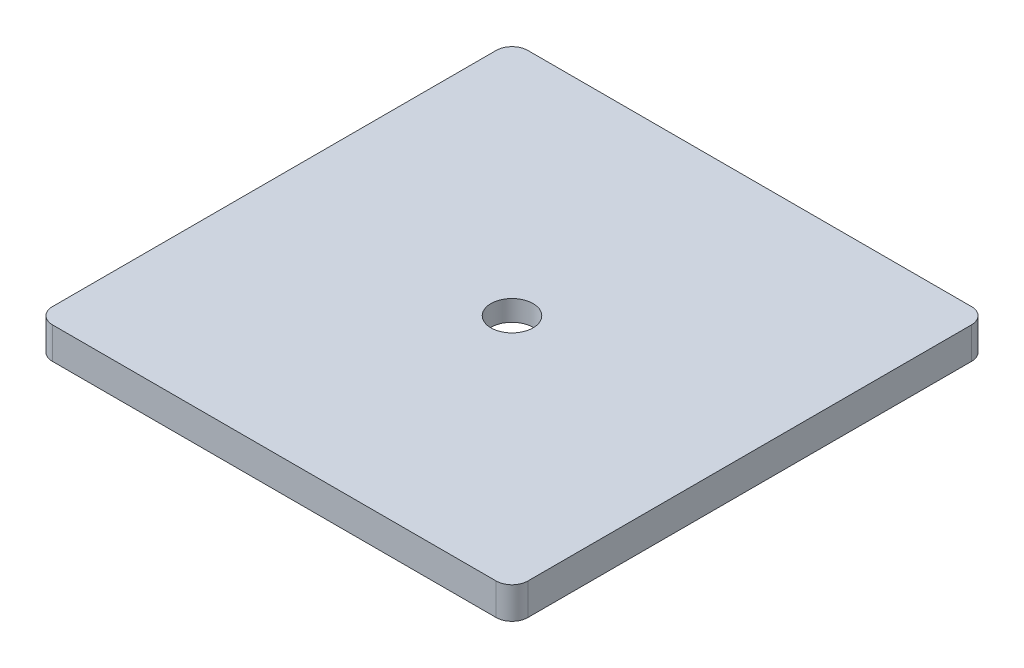
ISO-10303-21;
HEADER;
FILE_DESCRIPTION(('STEP AP214'),'2;1');
FILE_NAME('part.step','',(''),(''),'','','');
FILE_SCHEMA(('AUTOMOTIVE_DESIGN { 1 0 10303 214 1 1 1 1 }'));
ENDSEC;
DATA;
#1=APPLICATION_CONTEXT('core data for automotive mechanical design processes');
#2=APPLICATION_PROTOCOL_DEFINITION('international standard','automotive_design',2000,#1);
#3=PRODUCT_CONTEXT('',#1,'mechanical');
#4=PRODUCT('Part','Part','',(#3));
#5=PRODUCT_RELATED_PRODUCT_CATEGORY('part','',(#4));
#6=PRODUCT_DEFINITION_FORMATION('','',#4);
#7=PRODUCT_DEFINITION_CONTEXT('part definition',#1,'design');
#8=PRODUCT_DEFINITION('design','',#6,#7);
#9=PRODUCT_DEFINITION_SHAPE('','',#8);
#10=(LENGTH_UNIT() NAMED_UNIT(*) SI_UNIT(.MILLI.,.METRE.));
#11=(NAMED_UNIT(*) PLANE_ANGLE_UNIT() SI_UNIT($,.RADIAN.));
#12=(NAMED_UNIT(*) SI_UNIT($,.STERADIAN.) SOLID_ANGLE_UNIT());
#13=UNCERTAINTY_MEASURE_WITH_UNIT(LENGTH_MEASURE(1.E-05),#10,'distance_accuracy_value','');
#14=(GEOMETRIC_REPRESENTATION_CONTEXT(3) GLOBAL_UNCERTAINTY_ASSIGNED_CONTEXT((#13)) GLOBAL_UNIT_ASSIGNED_CONTEXT((#10,
#11,#12)) REPRESENTATION_CONTEXT('',''));
#15=CARTESIAN_POINT('',(0.,0.,0.));
#16=DIRECTION('',(0.,0.,1.));
#17=DIRECTION('',(1.,0.,0.));
#18=AXIS2_PLACEMENT_3D('',#15,#16,#17);
#19=CARTESIAN_POINT('',(38.1,5.08,-38.1));
#20=DIRECTION('',(-1.,0.,0.));
#21=DIRECTION('',(0.,0.,1.));
#22=AXIS2_PLACEMENT_3D('',#19,#20,#21);
#23=PLANE('',#22);
#24=DIRECTION('',(0.,0.,-1.));
#25=VECTOR('',#24,1.);
#26=CARTESIAN_POINT('',(38.1,0.,-38.1));
#27=LINE('',#26,#25);
#28=CARTESIAN_POINT('',(38.1,0.,35.56));
#29=VERTEX_POINT('',#28);
#30=CARTESIAN_POINT('',(38.1,0.,-35.56));
#31=VERTEX_POINT('',#30);
#32=EDGE_CURVE('E355',#29,#31,#27,.T.);
#33=ORIENTED_EDGE('',*,*,#32,.T.);
#34=DIRECTION('',(0.,-1.,0.));
#35=VECTOR('',#34,1.);
#36=CARTESIAN_POINT('',(38.1,5.08,-35.56));
#37=LINE('',#36,#35);
#38=CARTESIAN_POINT('',(38.1,5.08,-35.56));
#39=VERTEX_POINT('',#38);
#40=EDGE_CURVE('E394',#31,#39,#37,.F.);
#41=ORIENTED_EDGE('',*,*,#40,.T.);
#42=DIRECTION('',(0.,0.,-1.));
#43=VECTOR('',#42,1.);
#44=CARTESIAN_POINT('',(38.1,5.08,-38.1));
#45=LINE('',#44,#43);
#46=CARTESIAN_POINT('',(38.1,5.08,35.56));
#47=VERTEX_POINT('',#46);
#48=EDGE_CURVE('E336',#47,#39,#45,.T.);
#49=ORIENTED_EDGE('',*,*,#48,.F.);
#50=DIRECTION('',(0.,-1.,0.));
#51=VECTOR('',#50,1.);
#52=CARTESIAN_POINT('',(38.1,5.08,35.56));
#53=LINE('',#52,#51);
#54=EDGE_CURVE('E391',#47,#29,#53,.T.);
#55=ORIENTED_EDGE('',*,*,#54,.T.);
#56=EDGE_LOOP('',(#33,#41,#49,#55));
#57=FACE_BOUND('',#56,.T.);
#58=ADVANCED_FACE('F46',(#57),#23,.F.);
#59=CARTESIAN_POINT('',(-38.1,5.08,-38.1));
#60=DIRECTION('',(0.,0.,1.));
#61=DIRECTION('',(1.,0.,0.));
#62=AXIS2_PLACEMENT_3D('',#59,#60,#61);
#63=PLANE('',#62);
#64=DIRECTION('',(-1.,0.,0.));
#65=VECTOR('',#64,1.);
#66=CARTESIAN_POINT('',(-38.1,0.,-38.1));
#67=LINE('',#66,#65);
#68=CARTESIAN_POINT('',(35.56,0.,-38.1));
#69=VERTEX_POINT('',#68);
#70=CARTESIAN_POINT('',(-35.56,0.,-38.1));
#71=VERTEX_POINT('',#70);
#72=EDGE_CURVE('E358',#69,#71,#67,.T.);
#73=ORIENTED_EDGE('',*,*,#72,.T.);
#74=DIRECTION('',(0.,-1.,0.));
#75=VECTOR('',#74,1.);
#76=CARTESIAN_POINT('',(-35.56,5.08,-38.1));
#77=LINE('',#76,#75);
#78=CARTESIAN_POINT('',(-35.56,5.08,-38.1));
#79=VERTEX_POINT('',#78);
#80=EDGE_CURVE('E381',#71,#79,#77,.F.);
#81=ORIENTED_EDGE('',*,*,#80,.T.);
#82=DIRECTION('',(-1.,0.,0.));
#83=VECTOR('',#82,1.);
#84=CARTESIAN_POINT('',(-38.1,5.08,-38.1));
#85=LINE('',#84,#83);
#86=CARTESIAN_POINT('',(35.56,5.08,-38.1));
#87=VERTEX_POINT('',#86);
#88=EDGE_CURVE('E344',#87,#79,#85,.T.);
#89=ORIENTED_EDGE('',*,*,#88,.F.);
#90=DIRECTION('',(0.,-1.,0.));
#91=VECTOR('',#90,1.);
#92=CARTESIAN_POINT('',(35.56,5.08,-38.1));
#93=LINE('',#92,#91);
#94=EDGE_CURVE('E378',#87,#69,#93,.T.);
#95=ORIENTED_EDGE('',*,*,#94,.T.);
#96=EDGE_LOOP('',(#73,#81,#89,#95));
#97=FACE_BOUND('',#96,.T.);
#98=ADVANCED_FACE('F528',(#97),#63,.F.);
#99=CARTESIAN_POINT('',(-38.1,5.08,-38.1));
#100=DIRECTION('',(1.,0.,0.));
#101=DIRECTION('',(0.,0.,-1.));
#102=AXIS2_PLACEMENT_3D('',#99,#100,#101);
#103=PLANE('',#102);
#104=DIRECTION('',(0.,0.,1.));
#105=VECTOR('',#104,1.);
#106=CARTESIAN_POINT('',(-38.1,5.08,-38.1));
#107=LINE('',#106,#105);
#108=CARTESIAN_POINT('',(-38.1,5.08,-35.56));
#109=VERTEX_POINT('',#108);
#110=CARTESIAN_POINT('',(-38.1,5.08,35.56));
#111=VERTEX_POINT('',#110);
#112=EDGE_CURVE('E348',#109,#111,#107,.T.);
#113=ORIENTED_EDGE('',*,*,#112,.F.);
#114=DIRECTION('',(0.,-1.,0.));
#115=VECTOR('',#114,1.);
#116=CARTESIAN_POINT('',(-38.1,5.08,-35.56));
#117=LINE('',#116,#115);
#118=CARTESIAN_POINT('',(-38.1,0.,-35.56));
#119=VERTEX_POINT('',#118);
#120=EDGE_CURVE('E367',#109,#119,#117,.T.);
#121=ORIENTED_EDGE('',*,*,#120,.T.);
#122=DIRECTION('',(0.,0.,1.));
#123=VECTOR('',#122,1.);
#124=CARTESIAN_POINT('',(-38.1,0.,-38.1));
#125=LINE('',#124,#123);
#126=CARTESIAN_POINT('',(-38.1,0.,35.56));
#127=VERTEX_POINT('',#126);
#128=EDGE_CURVE('E361',#119,#127,#125,.T.);
#129=ORIENTED_EDGE('',*,*,#128,.T.);
#130=DIRECTION('',(0.,-1.,0.));
#131=VECTOR('',#130,1.);
#132=CARTESIAN_POINT('',(-38.1,5.08,35.56));
#133=LINE('',#132,#131);
#134=EDGE_CURVE('E354',#127,#111,#133,.F.);
#135=ORIENTED_EDGE('',*,*,#134,.T.);
#136=EDGE_LOOP('',(#113,#121,#129,#135));
#137=FACE_BOUND('',#136,.T.);
#138=ADVANCED_FACE('F534',(#137),#103,.F.);
#139=CARTESIAN_POINT('',(-38.1,5.08,38.1));
#140=DIRECTION('',(0.,0.,-1.));
#141=DIRECTION('',(-1.,0.,0.));
#142=AXIS2_PLACEMENT_3D('',#139,#140,#141);
#143=PLANE('',#142);
#144=DIRECTION('',(1.,0.,0.));
#145=VECTOR('',#144,1.);
#146=CARTESIAN_POINT('',(-38.1,5.08,38.1));
#147=LINE('',#146,#145);
#148=CARTESIAN_POINT('',(-35.56,5.08,38.1));
#149=VERTEX_POINT('',#148);
#150=CARTESIAN_POINT('',(35.56,5.08,38.1));
#151=VERTEX_POINT('',#150);
#152=EDGE_CURVE('E351',#149,#151,#147,.T.);
#153=ORIENTED_EDGE('',*,*,#152,.F.);
#154=DIRECTION('',(0.,-1.,0.));
#155=VECTOR('',#154,1.);
#156=CARTESIAN_POINT('',(-35.56,5.08,38.1));
#157=LINE('',#156,#155);
#158=CARTESIAN_POINT('',(-35.56,0.,38.1));
#159=VERTEX_POINT('',#158);
#160=EDGE_CURVE('E12',#149,#159,#157,.T.);
#161=ORIENTED_EDGE('',*,*,#160,.T.);
#162=DIRECTION('',(1.,0.,0.));
#163=VECTOR('',#162,1.);
#164=CARTESIAN_POINT('',(-38.1,0.,38.1));
#165=LINE('',#164,#163);
#166=CARTESIAN_POINT('',(35.56,0.,38.1));
#167=VERTEX_POINT('',#166);
#168=EDGE_CURVE('E345',#159,#167,#165,.T.);
#169=ORIENTED_EDGE('',*,*,#168,.T.);
#170=DIRECTION('',(0.,-1.,0.));
#171=VECTOR('',#170,1.);
#172=CARTESIAN_POINT('',(35.56,5.08,38.1));
#173=LINE('',#172,#171);
#174=EDGE_CURVE('E55',#167,#151,#173,.F.);
#175=ORIENTED_EDGE('',*,*,#174,.T.);
#176=EDGE_LOOP('',(#153,#161,#169,#175));
#177=FACE_BOUND('',#176,.T.);
#178=ADVANCED_FACE('F563',(#177),#143,.F.);
#179=CARTESIAN_POINT('',(0.,5.08,0.));
#180=DIRECTION('',(0.,1.,0.));
#181=DIRECTION('',(0.,0.,1.));
#182=AXIS2_PLACEMENT_3D('',#179,#180,#181);
#183=PLANE('',#182);
#184=CARTESIAN_POINT('',(0.,5.08,0.));
#185=DIRECTION('',(0.,-1.,0.));
#186=DIRECTION('',(0.,0.,-1.));
#187=AXIS2_PLACEMENT_3D('',#184,#185,#186);
#188=CIRCLE('',#187,3.3782);
#189=CARTESIAN_POINT('',(0.,5.08,-3.3782));
#190=VERTEX_POINT('',#189);
#191=EDGE_CURVE('E237',#190,#190,#188,.T.);
#192=ORIENTED_EDGE('',*,*,#191,.T.);
#193=EDGE_LOOP('',(#192));
#194=FACE_BOUND('',#193,.T.);
#195=ORIENTED_EDGE('',*,*,#88,.T.);
#196=CARTESIAN_POINT('',(-35.56,5.08,-35.56));
#197=DIRECTION('',(0.,1.,0.));
#198=DIRECTION('',(0.,0.,1.));
#199=AXIS2_PLACEMENT_3D('',#196,#197,#198);
#200=CIRCLE('',#199,2.54);
#201=EDGE_CURVE('E389',#79,#109,#200,.T.);
#202=ORIENTED_EDGE('',*,*,#201,.T.);
#203=ORIENTED_EDGE('',*,*,#112,.T.);
#204=CARTESIAN_POINT('',(-35.56,5.08,35.56));
#205=DIRECTION('',(0.,1.,0.));
#206=DIRECTION('',(0.,0.,1.));
#207=AXIS2_PLACEMENT_3D('',#204,#205,#206);
#208=CIRCLE('',#207,2.54);
#209=EDGE_CURVE('E385',#111,#149,#208,.T.);
#210=ORIENTED_EDGE('',*,*,#209,.T.);
#211=ORIENTED_EDGE('',*,*,#152,.T.);
#212=CARTESIAN_POINT('',(35.56,5.08,35.56));
#213=DIRECTION('',(0.,1.,0.));
#214=DIRECTION('',(0.,0.,1.));
#215=AXIS2_PLACEMENT_3D('',#212,#213,#214);
#216=CIRCLE('',#215,2.54);
#217=EDGE_CURVE('E383',#151,#47,#216,.T.);
#218=ORIENTED_EDGE('',*,*,#217,.T.);
#219=ORIENTED_EDGE('',*,*,#48,.T.);
#220=CARTESIAN_POINT('',(35.56,5.08,-35.56));
#221=DIRECTION('',(0.,1.,0.));
#222=DIRECTION('',(0.,0.,1.));
#223=AXIS2_PLACEMENT_3D('',#220,#221,#222);
#224=CIRCLE('',#223,2.54);
#225=EDGE_CURVE('E387',#39,#87,#224,.T.);
#226=ORIENTED_EDGE('',*,*,#225,.T.);
#227=EDGE_LOOP('',(#195,#202,#203,#210,#211,#218,#219,#226));
#228=FACE_BOUND('',#227,.T.);
#229=ADVANCED_FACE('F559',(#194,#228),#183,.T.);
#230=CARTESIAN_POINT('',(0.,0.,0.));
#231=DIRECTION('',(0.,1.,0.));
#232=DIRECTION('',(0.,0.,1.));
#233=AXIS2_PLACEMENT_3D('',#230,#231,#232);
#234=PLANE('',#233);
#235=DIRECTION('',(-1.,0.,0.));
#236=VECTOR('',#235,1.);
#237=CARTESIAN_POINT('',(-17.5895,0.,17.5895));
#238=LINE('',#237,#236);
#239=CARTESIAN_POINT('',(17.5895,0.,17.5895));
#240=VERTEX_POINT('',#239);
#241=CARTESIAN_POINT('',(-17.5895,0.,17.5895));
#242=VERTEX_POINT('',#241);
#243=EDGE_CURVE('E272',#240,#242,#238,.T.);
#244=ORIENTED_EDGE('',*,*,#243,.F.);
#245=DIRECTION('',(0.,0.,1.));
#246=VECTOR('',#245,1.);
#247=CARTESIAN_POINT('',(17.5895,0.,17.5895));
#248=LINE('',#247,#246);
#249=CARTESIAN_POINT('',(17.5895,0.,-17.5895));
#250=VERTEX_POINT('',#249);
#251=EDGE_CURVE('E397',#250,#240,#248,.T.);
#252=ORIENTED_EDGE('',*,*,#251,.F.);
#253=DIRECTION('',(1.,0.,0.));
#254=VECTOR('',#253,1.);
#255=CARTESIAN_POINT('',(-17.5895,0.,-17.5895));
#256=LINE('',#255,#254);
#257=CARTESIAN_POINT('',(-17.5895,0.,-17.5895));
#258=VERTEX_POINT('',#257);
#259=EDGE_CURVE('E399',#258,#250,#256,.T.);
#260=ORIENTED_EDGE('',*,*,#259,.F.);
#261=DIRECTION('',(0.,0.,-1.));
#262=VECTOR('',#261,1.);
#263=CARTESIAN_POINT('',(-17.5895,0.,17.5895));
#264=LINE('',#263,#262);
#265=EDGE_CURVE('E404',#242,#258,#264,.T.);
#266=ORIENTED_EDGE('',*,*,#265,.F.);
#267=EDGE_LOOP('',(#244,#252,#260,#266));
#268=FACE_BOUND('',#267,.T.);
#269=ORIENTED_EDGE('',*,*,#128,.F.);
#270=CARTESIAN_POINT('',(-35.56,0.,-35.56));
#271=DIRECTION('',(0.,1.,0.));
#272=DIRECTION('',(0.,0.,1.));
#273=AXIS2_PLACEMENT_3D('',#270,#271,#272);
#274=CIRCLE('',#273,2.54);
#275=EDGE_CURVE('E376',#119,#71,#274,.F.);
#276=ORIENTED_EDGE('',*,*,#275,.T.);
#277=ORIENTED_EDGE('',*,*,#72,.F.);
#278=CARTESIAN_POINT('',(35.56,0.,-35.56));
#279=DIRECTION('',(0.,1.,0.));
#280=DIRECTION('',(0.,0.,1.));
#281=AXIS2_PLACEMENT_3D('',#278,#279,#280);
#282=CIRCLE('',#281,2.54);
#283=EDGE_CURVE('E374',#69,#31,#282,.F.);
#284=ORIENTED_EDGE('',*,*,#283,.T.);
#285=ORIENTED_EDGE('',*,*,#32,.F.);
#286=CARTESIAN_POINT('',(35.56,0.,35.56));
#287=DIRECTION('',(0.,1.,0.));
#288=DIRECTION('',(0.,0.,1.));
#289=AXIS2_PLACEMENT_3D('',#286,#287,#288);
#290=CIRCLE('',#289,2.54);
#291=EDGE_CURVE('E370',#29,#167,#290,.F.);
#292=ORIENTED_EDGE('',*,*,#291,.T.);
#293=ORIENTED_EDGE('',*,*,#168,.F.);
#294=CARTESIAN_POINT('',(-35.56,0.,35.56));
#295=DIRECTION('',(0.,1.,0.));
#296=DIRECTION('',(0.,0.,1.));
#297=AXIS2_PLACEMENT_3D('',#294,#295,#296);
#298=CIRCLE('',#297,2.54);
#299=EDGE_CURVE('E372',#159,#127,#298,.F.);
#300=ORIENTED_EDGE('',*,*,#299,.T.);
#301=EDGE_LOOP('',(#269,#276,#277,#284,#285,#292,#293,#300));
#302=FACE_BOUND('',#301,.T.);
#303=ADVANCED_FACE('F543',(#268,#302),#234,.F.);
#304=CARTESIAN_POINT('',(-35.56,5.08,-35.56));
#305=DIRECTION('',(0.,-1.,0.));
#306=DIRECTION('',(0.,0.,-1.));
#307=AXIS2_PLACEMENT_3D('',#304,#305,#306);
#308=CYLINDRICAL_SURFACE('',#307,2.54);
#309=ORIENTED_EDGE('',*,*,#201,.F.);
#310=ORIENTED_EDGE('',*,*,#80,.F.);
#311=ORIENTED_EDGE('',*,*,#275,.F.);
#312=ORIENTED_EDGE('',*,*,#120,.F.);
#313=EDGE_LOOP('',(#309,#310,#311,#312));
#314=FACE_BOUND('',#313,.T.);
#315=ADVANCED_FACE('F539',(#314),#308,.T.);
#316=CARTESIAN_POINT('',(35.56,5.08,-35.56));
#317=DIRECTION('',(0.,-1.,0.));
#318=DIRECTION('',(0.,0.,-1.));
#319=AXIS2_PLACEMENT_3D('',#316,#317,#318);
#320=CYLINDRICAL_SURFACE('',#319,2.54);
#321=ORIENTED_EDGE('',*,*,#225,.F.);
#322=ORIENTED_EDGE('',*,*,#40,.F.);
#323=ORIENTED_EDGE('',*,*,#283,.F.);
#324=ORIENTED_EDGE('',*,*,#94,.F.);
#325=EDGE_LOOP('',(#321,#322,#323,#324));
#326=FACE_BOUND('',#325,.T.);
#327=ADVANCED_FACE('F542',(#326),#320,.T.);
#328=CARTESIAN_POINT('',(-35.56,5.08,35.56));
#329=DIRECTION('',(0.,-1.,0.));
#330=DIRECTION('',(0.,0.,-1.));
#331=AXIS2_PLACEMENT_3D('',#328,#329,#330);
#332=CYLINDRICAL_SURFACE('',#331,2.54);
#333=ORIENTED_EDGE('',*,*,#209,.F.);
#334=ORIENTED_EDGE('',*,*,#134,.F.);
#335=ORIENTED_EDGE('',*,*,#299,.F.);
#336=ORIENTED_EDGE('',*,*,#160,.F.);
#337=EDGE_LOOP('',(#333,#334,#335,#336));
#338=FACE_BOUND('',#337,.T.);
#339=ADVANCED_FACE('F546',(#338),#332,.T.);
#340=CARTESIAN_POINT('',(35.56,5.08,35.56));
#341=DIRECTION('',(0.,-1.,0.));
#342=DIRECTION('',(0.,0.,-1.));
#343=AXIS2_PLACEMENT_3D('',#340,#341,#342);
#344=CYLINDRICAL_SURFACE('',#343,2.54);
#345=ORIENTED_EDGE('',*,*,#217,.F.);
#346=ORIENTED_EDGE('',*,*,#174,.F.);
#347=ORIENTED_EDGE('',*,*,#291,.F.);
#348=ORIENTED_EDGE('',*,*,#54,.F.);
#349=EDGE_LOOP('',(#345,#346,#347,#348));
#350=FACE_BOUND('',#349,.T.);
#351=ADVANCED_FACE('F48',(#350),#344,.T.);
#352=CARTESIAN_POINT('',(0.,7.77035755338781,12.9141153704192));
#353=DIRECTION('',(0.,0.515563217323744,0.856851544284534));
#354=DIRECTION('',(0.,-0.856851544284534,0.515563217323744));
#355=AXIS2_PLACEMENT_3D('',#352,#353,#354);
#356=PLANE('',#355);
#357=DIRECTION('',(-0.426837907637421,-0.774874970787934,0.466238329880875));
#358=VECTOR('',#357,1.);
#359=CARTESIAN_POINT('',(-17.5895,0.,17.5895));
#360=LINE('',#359,#358);
#361=CARTESIAN_POINT('',(-21.717,-7.49299999999997,22.098));
#362=VERTEX_POINT('',#361);
#363=EDGE_CURVE('E267',#242,#362,#360,.T.);
#364=ORIENTED_EDGE('',*,*,#363,.T.);
#365=DIRECTION('',(1.,0.,0.));
#366=VECTOR('',#365,1.);
#367=CARTESIAN_POINT('',(-21.717,-7.49299999999997,22.098));
#368=LINE('',#367,#366);
#369=CARTESIAN_POINT('',(21.717,-7.49299999999997,22.098));
#370=VERTEX_POINT('',#369);
#371=EDGE_CURVE('E474',#362,#370,#368,.T.);
#372=ORIENTED_EDGE('',*,*,#371,.T.);
#373=DIRECTION('',(0.426837907637421,-0.774874970787934,0.466238329880875));
#374=VECTOR('',#373,1.);
#375=CARTESIAN_POINT('',(17.5895,0.,17.5895));
#376=LINE('',#375,#374);
#377=EDGE_CURVE('E71',#240,#370,#376,.T.);
#378=ORIENTED_EDGE('',*,*,#377,.F.);
#379=ORIENTED_EDGE('',*,*,#243,.T.);
#380=EDGE_LOOP('',(#364,#372,#378,#379));
#381=FACE_BOUND('',#380,.T.);
#382=ADVANCED_FACE('F307',(#381),#356,.T.);
#383=CARTESIAN_POINT('',(13.4947489117858,7.43354812937352,0.));
#384=DIRECTION('',(0.875902280321517,0.482488544244904,0.));
#385=DIRECTION('',(-0.482488544244904,0.875902280321517,0.));
#386=AXIS2_PLACEMENT_3D('',#383,#384,#385);
#387=PLANE('',#386);
#388=ORIENTED_EDGE('',*,*,#377,.T.);
#389=DIRECTION('',(0.,0.,-1.));
#390=VECTOR('',#389,1.);
#391=CARTESIAN_POINT('',(21.717,-7.49299999999997,22.098));
#392=LINE('',#391,#390);
#393=CARTESIAN_POINT('',(21.717,-7.49299999999997,-22.098));
#394=VERTEX_POINT('',#393);
#395=EDGE_CURVE('E290',#370,#394,#392,.T.);
#396=ORIENTED_EDGE('',*,*,#395,.T.);
#397=DIRECTION('',(0.426837907637421,-0.774874970787933,-0.466238329880876));
#398=VECTOR('',#397,1.);
#399=CARTESIAN_POINT('',(17.5895,0.,-17.5895));
#400=LINE('',#399,#398);
#401=EDGE_CURVE('E277',#250,#394,#400,.T.);
#402=ORIENTED_EDGE('',*,*,#401,.F.);
#403=ORIENTED_EDGE('',*,*,#251,.T.);
#404=EDGE_LOOP('',(#388,#396,#402,#403));
#405=FACE_BOUND('',#404,.T.);
#406=ADVANCED_FACE('F296',(#405),#387,.T.);
#407=CARTESIAN_POINT('',(-13.4947489117858,7.43354812937352,0.));
#408=DIRECTION('',(-0.875902280321518,0.482488544244903,0.));
#409=DIRECTION('',(-0.482488544244903,-0.875902280321518,0.));
#410=AXIS2_PLACEMENT_3D('',#407,#408,#409);
#411=PLANE('',#410);
#412=DIRECTION('',(-0.42683790763742,-0.774874970787934,-0.466238329880876));
#413=VECTOR('',#412,1.);
#414=CARTESIAN_POINT('',(-17.5895,0.,-17.5895));
#415=LINE('',#414,#413);
#416=CARTESIAN_POINT('',(-21.717,-7.49299999999997,-22.098));
#417=VERTEX_POINT('',#416);
#418=EDGE_CURVE('E266',#258,#417,#415,.T.);
#419=ORIENTED_EDGE('',*,*,#418,.T.);
#420=DIRECTION('',(0.,0.,1.));
#421=VECTOR('',#420,1.);
#422=CARTESIAN_POINT('',(-21.717,-7.49299999999997,-22.098));
#423=LINE('',#422,#421);
#424=EDGE_CURVE('E421',#417,#362,#423,.T.);
#425=ORIENTED_EDGE('',*,*,#424,.T.);
#426=ORIENTED_EDGE('',*,*,#363,.F.);
#427=ORIENTED_EDGE('',*,*,#265,.T.);
#428=EDGE_LOOP('',(#419,#425,#426,#427));
#429=FACE_BOUND('',#428,.T.);
#430=ADVANCED_FACE('F306',(#429),#411,.T.);
#431=CARTESIAN_POINT('',(0.,7.77035755338784,-12.9141153704192));
#432=DIRECTION('',(0.,0.515563217323745,-0.856851544284533));
#433=DIRECTION('',(0.,0.856851544284533,0.515563217323745));
#434=AXIS2_PLACEMENT_3D('',#431,#432,#433);
#435=PLANE('',#434);
#436=ORIENTED_EDGE('',*,*,#401,.T.);
#437=DIRECTION('',(-1.,0.,0.));
#438=VECTOR('',#437,1.);
#439=CARTESIAN_POINT('',(21.717,-7.49299999999997,-22.098));
#440=LINE('',#439,#438);
#441=EDGE_CURVE('E282',#394,#417,#440,.T.);
#442=ORIENTED_EDGE('',*,*,#441,.T.);
#443=ORIENTED_EDGE('',*,*,#418,.F.);
#444=ORIENTED_EDGE('',*,*,#259,.T.);
#445=EDGE_LOOP('',(#436,#442,#443,#444));
#446=FACE_BOUND('',#445,.T.);
#447=ADVANCED_FACE('F313',(#446),#435,.T.);
#448=CARTESIAN_POINT('',(-21.717,-7.49299999999997,-22.098));
#449=DIRECTION('',(-1.,0.,0.));
#450=DIRECTION('',(0.,0.,1.));
#451=AXIS2_PLACEMENT_3D('',#448,#449,#450);
#452=PLANE('',#451);
#453=DIRECTION('',(0.,0.,-1.));
#454=VECTOR('',#453,1.);
#455=CARTESIAN_POINT('',(-21.717,-8.89000000000001,-22.098));
#456=LINE('',#455,#454);
#457=CARTESIAN_POINT('',(-21.717,-8.89000000000001,22.098));
#458=VERTEX_POINT('',#457);
#459=CARTESIAN_POINT('',(-21.717,-8.89000000000001,-22.098));
#460=VERTEX_POINT('',#459);
#461=EDGE_CURVE('E252',#458,#460,#456,.T.);
#462=ORIENTED_EDGE('',*,*,#461,.F.);
#463=DIRECTION('',(0.,-1.,0.));
#464=VECTOR('',#463,1.);
#465=CARTESIAN_POINT('',(-21.717,-7.49299999999997,22.098));
#466=LINE('',#465,#464);
#467=EDGE_CURVE('E400',#362,#458,#466,.T.);
#468=ORIENTED_EDGE('',*,*,#467,.F.);
#469=ORIENTED_EDGE('',*,*,#424,.F.);
#470=DIRECTION('',(0.,-1.,0.));
#471=VECTOR('',#470,1.);
#472=CARTESIAN_POINT('',(-21.717,-7.49299999999997,-22.098));
#473=LINE('',#472,#471);
#474=EDGE_CURVE('E264',#417,#460,#473,.T.);
#475=ORIENTED_EDGE('',*,*,#474,.T.);
#476=EDGE_LOOP('',(#462,#468,#469,#475));
#477=FACE_BOUND('',#476,.T.);
#478=ADVANCED_FACE('F426',(#477),#452,.T.);
#479=CARTESIAN_POINT('',(21.717,-7.49299999999997,22.098));
#480=DIRECTION('',(0.,0.,1.));
#481=DIRECTION('',(1.,0.,0.));
#482=AXIS2_PLACEMENT_3D('',#479,#480,#481);
#483=PLANE('',#482);
#484=DIRECTION('',(-1.,0.,0.));
#485=VECTOR('',#484,1.);
#486=CARTESIAN_POINT('',(21.717,-8.89000000000001,22.098));
#487=LINE('',#486,#485);
#488=CARTESIAN_POINT('',(21.717,-8.89000000000001,22.098));
#489=VERTEX_POINT('',#488);
#490=EDGE_CURVE('E261',#489,#458,#487,.T.);
#491=ORIENTED_EDGE('',*,*,#490,.F.);
#492=DIRECTION('',(0.,-1.,0.));
#493=VECTOR('',#492,1.);
#494=CARTESIAN_POINT('',(21.717,-7.49299999999997,22.098));
#495=LINE('',#494,#493);
#496=EDGE_CURVE('E414',#370,#489,#495,.T.);
#497=ORIENTED_EDGE('',*,*,#496,.F.);
#498=ORIENTED_EDGE('',*,*,#371,.F.);
#499=ORIENTED_EDGE('',*,*,#467,.T.);
#500=EDGE_LOOP('',(#491,#497,#498,#499));
#501=FACE_BOUND('',#500,.T.);
#502=ADVANCED_FACE('F435',(#501),#483,.T.);
#503=CARTESIAN_POINT('',(21.717,-7.49299999999997,-22.098));
#504=DIRECTION('',(1.,0.,0.));
#505=DIRECTION('',(0.,0.,-1.));
#506=AXIS2_PLACEMENT_3D('',#503,#504,#505);
#507=PLANE('',#506);
#508=DIRECTION('',(0.,0.,1.));
#509=VECTOR('',#508,1.);
#510=CARTESIAN_POINT('',(21.717,-8.89000000000001,-22.098));
#511=LINE('',#510,#509);
#512=CARTESIAN_POINT('',(21.717,-8.89000000000001,-22.098));
#513=VERTEX_POINT('',#512);
#514=EDGE_CURVE('E258',#513,#489,#511,.T.);
#515=ORIENTED_EDGE('',*,*,#514,.F.);
#516=DIRECTION('',(0.,-1.,0.));
#517=VECTOR('',#516,1.);
#518=CARTESIAN_POINT('',(21.717,-7.49299999999997,-22.098));
#519=LINE('',#518,#517);
#520=EDGE_CURVE('E450',#394,#513,#519,.T.);
#521=ORIENTED_EDGE('',*,*,#520,.F.);
#522=ORIENTED_EDGE('',*,*,#395,.F.);
#523=ORIENTED_EDGE('',*,*,#496,.T.);
#524=EDGE_LOOP('',(#515,#521,#522,#523));
#525=FACE_BOUND('',#524,.T.);
#526=ADVANCED_FACE('F441',(#525),#507,.T.);
#527=CARTESIAN_POINT('',(21.717,-7.49299999999997,-22.098));
#528=DIRECTION('',(0.,0.,-1.));
#529=DIRECTION('',(-1.,0.,0.));
#530=AXIS2_PLACEMENT_3D('',#527,#528,#529);
#531=PLANE('',#530);
#532=DIRECTION('',(1.,0.,0.));
#533=VECTOR('',#532,1.);
#534=CARTESIAN_POINT('',(21.717,-8.89000000000001,-22.098));
#535=LINE('',#534,#533);
#536=EDGE_CURVE('E255',#460,#513,#535,.T.);
#537=ORIENTED_EDGE('',*,*,#536,.F.);
#538=ORIENTED_EDGE('',*,*,#474,.F.);
#539=ORIENTED_EDGE('',*,*,#441,.F.);
#540=ORIENTED_EDGE('',*,*,#520,.T.);
#541=EDGE_LOOP('',(#537,#538,#539,#540));
#542=FACE_BOUND('',#541,.T.);
#543=ADVANCED_FACE('F436',(#542),#531,.T.);
#544=CARTESIAN_POINT('',(0.,-8.89000000000001,0.));
#545=DIRECTION('',(0.,-1.,0.));
#546=DIRECTION('',(0.,0.,-1.));
#547=AXIS2_PLACEMENT_3D('',#544,#545,#546);
#548=PLANE('',#547);
#549=DIRECTION('',(0.,0.,-1.));
#550=VECTOR('',#549,1.);
#551=CARTESIAN_POINT('',(-18.415,-8.89000000000001,0.));
#552=LINE('',#551,#550);
#553=CARTESIAN_POINT('',(-18.415,-8.89000000000001,18.796));
#554=VERTEX_POINT('',#553);
#555=CARTESIAN_POINT('',(-18.415,-8.89000000000001,-18.796));
#556=VERTEX_POINT('',#555);
#557=EDGE_CURVE('E233',#554,#556,#552,.T.);
#558=ORIENTED_EDGE('',*,*,#557,.F.);
#559=DIRECTION('',(-1.,0.,0.));
#560=VECTOR('',#559,1.);
#561=CARTESIAN_POINT('',(0.,-8.89000000000001,18.796));
#562=LINE('',#561,#560);
#563=CARTESIAN_POINT('',(18.415,-8.89000000000001,18.796));
#564=VERTEX_POINT('',#563);
#565=EDGE_CURVE('E241',#564,#554,#562,.T.);
#566=ORIENTED_EDGE('',*,*,#565,.F.);
#567=DIRECTION('',(0.,0.,1.));
#568=VECTOR('',#567,1.);
#569=CARTESIAN_POINT('',(18.415,-8.89000000000001,0.));
#570=LINE('',#569,#568);
#571=CARTESIAN_POINT('',(18.415,-8.89000000000001,-18.796));
#572=VERTEX_POINT('',#571);
#573=EDGE_CURVE('E63',#572,#564,#570,.T.);
#574=ORIENTED_EDGE('',*,*,#573,.F.);
#575=DIRECTION('',(1.,0.,0.));
#576=VECTOR('',#575,1.);
#577=CARTESIAN_POINT('',(0.,-8.89000000000001,-18.796));
#578=LINE('',#577,#576);
#579=EDGE_CURVE('E236',#556,#572,#578,.T.);
#580=ORIENTED_EDGE('',*,*,#579,.F.);
#581=EDGE_LOOP('',(#558,#566,#574,#580));
#582=FACE_BOUND('',#581,.T.);
#583=ORIENTED_EDGE('',*,*,#461,.T.);
#584=ORIENTED_EDGE('',*,*,#536,.T.);
#585=ORIENTED_EDGE('',*,*,#514,.T.);
#586=ORIENTED_EDGE('',*,*,#490,.T.);
#587=EDGE_LOOP('',(#583,#584,#585,#586));
#588=FACE_BOUND('',#587,.T.);
#589=ADVANCED_FACE('F440',(#582,#588),#548,.T.);
#590=CARTESIAN_POINT('',(0.,1.778,0.));
#591=DIRECTION('',(0.,1.,0.));
#592=DIRECTION('',(0.,0.,1.));
#593=AXIS2_PLACEMENT_3D('',#590,#591,#592);
#594=PLANE('',#593);
#595=CARTESIAN_POINT('',(0.,1.778,0.));
#596=DIRECTION('',(0.,-1.,0.));
#597=DIRECTION('',(0.,0.,-1.));
#598=AXIS2_PLACEMENT_3D('',#595,#596,#597);
#599=CIRCLE('',#598,3.3782);
#600=CARTESIAN_POINT('',(0.,1.778,-3.3782));
#601=VERTEX_POINT('',#600);
#602=EDGE_CURVE('E718',#601,#601,#599,.T.);
#603=ORIENTED_EDGE('',*,*,#602,.F.);
#604=EDGE_LOOP('',(#603));
#605=FACE_BOUND('',#604,.T.);
#606=DIRECTION('',(-1.,0.,0.));
#607=VECTOR('',#606,1.);
#608=CARTESIAN_POINT('',(0.,1.778,-12.6660433889435));
#609=LINE('',#608,#607);
#610=CARTESIAN_POINT('',(12.8402662953675,1.778,-12.6660433889435));
#611=VERTEX_POINT('',#610);
#612=CARTESIAN_POINT('',(-12.8402662953675,1.778,-12.6660433889435));
#613=VERTEX_POINT('',#612);
#614=EDGE_CURVE('E247',#611,#613,#609,.T.);
#615=ORIENTED_EDGE('',*,*,#614,.F.);
#616=DIRECTION('',(0.,0.,-1.));
#617=VECTOR('',#616,1.);
#618=CARTESIAN_POINT('',(12.8402662953675,1.778,0.));
#619=LINE('',#618,#617);
#620=CARTESIAN_POINT('',(12.8402662953675,1.778,12.6660433889436));
#621=VERTEX_POINT('',#620);
#622=EDGE_CURVE('E245',#621,#611,#619,.T.);
#623=ORIENTED_EDGE('',*,*,#622,.F.);
#624=DIRECTION('',(1.,0.,0.));
#625=VECTOR('',#624,1.);
#626=CARTESIAN_POINT('',(0.,1.778,12.6660433889436));
#627=LINE('',#626,#625);
#628=CARTESIAN_POINT('',(-12.8402662953675,1.778,12.6660433889436));
#629=VERTEX_POINT('',#628);
#630=EDGE_CURVE('E226',#629,#621,#627,.T.);
#631=ORIENTED_EDGE('',*,*,#630,.F.);
#632=DIRECTION('',(0.,0.,1.));
#633=VECTOR('',#632,1.);
#634=CARTESIAN_POINT('',(-12.8402662953675,1.778,0.));
#635=LINE('',#634,#633);
#636=EDGE_CURVE('E249',#613,#629,#635,.T.);
#637=ORIENTED_EDGE('',*,*,#636,.F.);
#638=EDGE_LOOP('',(#615,#623,#631,#637));
#639=FACE_BOUND('',#638,.T.);
#640=ADVANCED_FACE('F489',(#605,#639),#594,.F.);
#641=CARTESIAN_POINT('',(0.,6.0679678097848,10.0847915711917));
#642=DIRECTION('',(0.,0.515563217323744,0.856851544284534));
#643=DIRECTION('',(0.,-0.856851544284534,0.515563217323744));
#644=AXIS2_PLACEMENT_3D('',#641,#642,#643);
#645=PLANE('',#644);
#646=ORIENTED_EDGE('',*,*,#630,.T.);
#647=DIRECTION('',(0.426837907637421,-0.774874970787934,0.466238329880874));
#648=VECTOR('',#647,1.);
#649=CARTESIAN_POINT('',(8.56831048088269,9.53324286321852,7.99975319158326));
#650=LINE('',#649,#648);
#651=CARTESIAN_POINT('',(18.415,-8.34228580225599,18.7553678970806));
#652=VERTEX_POINT('',#651);
#653=EDGE_CURVE('E221',#621,#652,#650,.T.);
#654=ORIENTED_EDGE('',*,*,#653,.T.);
#655=DIRECTION('',(0.,-0.856851544284534,0.515563217323744));
#656=VECTOR('',#655,1.);
#657=CARTESIAN_POINT('',(18.415,10.328685552996,7.52113936976801));
#658=LINE('',#657,#656);
#659=CARTESIAN_POINT('',(18.415,-8.4098152127417,18.796));
#660=VERTEX_POINT('',#659);
#661=EDGE_CURVE('E215',#652,#660,#658,.T.);
#662=ORIENTED_EDGE('',*,*,#661,.T.);
#663=DIRECTION('',(1.,0.,0.));
#664=VECTOR('',#663,1.);
#665=CARTESIAN_POINT('',(0.,-8.4098152127417,18.796));
#666=LINE('',#665,#664);
#667=CARTESIAN_POINT('',(-18.415,-8.4098152127417,18.796));
#668=VERTEX_POINT('',#667);
#669=EDGE_CURVE('E199',#668,#660,#666,.T.);
#670=ORIENTED_EDGE('',*,*,#669,.F.);
#671=DIRECTION('',(0.,-0.856851544284534,0.515563217323744));
#672=VECTOR('',#671,1.);
#673=CARTESIAN_POINT('',(-18.415,6.0679678097848,10.0847915711917));
#674=LINE('',#673,#672);
#675=CARTESIAN_POINT('',(-18.415,-8.34228580225599,18.7553678970806));
#676=VERTEX_POINT('',#675);
#677=EDGE_CURVE('E229',#676,#668,#674,.T.);
#678=ORIENTED_EDGE('',*,*,#677,.F.);
#679=DIRECTION('',(-0.426837907637421,-0.774874970787934,0.466238329880875));
#680=VECTOR('',#679,1.);
#681=CARTESIAN_POINT('',(-8.5683104808827,9.53324286321852,7.99975319158326));
#682=LINE('',#681,#680);
#683=EDGE_CURVE('E723',#629,#676,#682,.T.);
#684=ORIENTED_EDGE('',*,*,#683,.F.);
#685=EDGE_LOOP('',(#646,#654,#662,#670,#678,#684));
#686=FACE_BOUND('',#685,.T.);
#687=ADVANCED_FACE('F219',(#686),#645,.F.);
#688=CARTESIAN_POINT('',(10.6025195821641,5.84037095627685,0.));
#689=DIRECTION('',(0.875902280321517,0.482488544244904,0.));
#690=DIRECTION('',(-0.482488544244904,0.875902280321517,0.));
#691=AXIS2_PLACEMENT_3D('',#688,#689,#690);
#692=PLANE('',#691);
#693=ORIENTED_EDGE('',*,*,#622,.T.);
#694=DIRECTION('',(0.426837907637421,-0.774874970787933,-0.466238329880876));
#695=VECTOR('',#694,1.);
#696=CARTESIAN_POINT('',(8.56831048088269,9.53324286321852,-7.99975319158324));
#697=LINE('',#696,#695);
#698=CARTESIAN_POINT('',(18.415,-8.34228580225599,-18.7553678970806));
#699=VERTEX_POINT('',#698);
#700=EDGE_CURVE('E728',#611,#699,#697,.T.);
#701=ORIENTED_EDGE('',*,*,#700,.T.);
#702=DIRECTION('',(0.,0.,-1.));
#703=VECTOR('',#702,1.);
#704=CARTESIAN_POINT('',(18.415,-8.34228580225599,0.));
#705=LINE('',#704,#703);
#706=EDGE_CURVE('E209',#652,#699,#705,.T.);
#707=ORIENTED_EDGE('',*,*,#706,.F.);
#708=ORIENTED_EDGE('',*,*,#653,.F.);
#709=EDGE_LOOP('',(#693,#701,#707,#708));
#710=FACE_BOUND('',#709,.T.);
#711=ADVANCED_FACE('F511',(#710),#692,.F.);
#712=CARTESIAN_POINT('',(-10.6025195821641,5.84037095627685,0.));
#713=DIRECTION('',(-0.875902280321518,0.482488544244903,0.));
#714=DIRECTION('',(-0.482488544244903,-0.875902280321518,0.));
#715=AXIS2_PLACEMENT_3D('',#712,#713,#714);
#716=PLANE('',#715);
#717=ORIENTED_EDGE('',*,*,#636,.T.);
#718=ORIENTED_EDGE('',*,*,#683,.T.);
#719=DIRECTION('',(0.,0.,1.));
#720=VECTOR('',#719,1.);
#721=CARTESIAN_POINT('',(-18.415,-8.34228580225599,0.));
#722=LINE('',#721,#720);
#723=CARTESIAN_POINT('',(-18.415,-8.34228580225599,-18.7553678970806));
#724=VERTEX_POINT('',#723);
#725=EDGE_CURVE('E210',#724,#676,#722,.T.);
#726=ORIENTED_EDGE('',*,*,#725,.F.);
#727=DIRECTION('',(-0.42683790763742,-0.774874970787933,-0.466238329880876));
#728=VECTOR('',#727,1.);
#729=CARTESIAN_POINT('',(-8.5683104808827,9.53324286321852,-7.99975319158324));
#730=LINE('',#729,#728);
#731=EDGE_CURVE('E726',#613,#724,#730,.T.);
#732=ORIENTED_EDGE('',*,*,#731,.F.);
#733=EDGE_LOOP('',(#717,#718,#726,#732));
#734=FACE_BOUND('',#733,.T.);
#735=ADVANCED_FACE('F507',(#734),#716,.F.);
#736=CARTESIAN_POINT('',(0.,6.0679678097848,-10.0847915711917));
#737=DIRECTION('',(0.,0.515563217323745,-0.856851544284533));
#738=DIRECTION('',(0.,0.856851544284533,0.515563217323745));
#739=AXIS2_PLACEMENT_3D('',#736,#737,#738);
#740=PLANE('',#739);
#741=ORIENTED_EDGE('',*,*,#614,.T.);
#742=ORIENTED_EDGE('',*,*,#731,.T.);
#743=DIRECTION('',(0.,-0.856851544284533,-0.515563217323745));
#744=VECTOR('',#743,1.);
#745=CARTESIAN_POINT('',(-18.415,-9.19538974360301,-19.2686762007725));
#746=LINE('',#745,#744);
#747=CARTESIAN_POINT('',(-18.415,-8.4098152127417,-18.796));
#748=VERTEX_POINT('',#747);
#749=EDGE_CURVE('E223',#724,#748,#746,.T.);
#750=ORIENTED_EDGE('',*,*,#749,.T.);
#751=DIRECTION('',(-1.,0.,0.));
#752=VECTOR('',#751,1.);
#753=CARTESIAN_POINT('',(0.,-8.4098152127417,-18.796));
#754=LINE('',#753,#752);
#755=CARTESIAN_POINT('',(18.415,-8.4098152127417,-18.796));
#756=VERTEX_POINT('',#755);
#757=EDGE_CURVE('E730',#756,#748,#754,.T.);
#758=ORIENTED_EDGE('',*,*,#757,.F.);
#759=DIRECTION('',(0.,-0.856851544284533,-0.515563217323745));
#760=VECTOR('',#759,1.);
#761=CARTESIAN_POINT('',(18.415,6.0679678097848,-10.0847915711917));
#762=LINE('',#761,#760);
#763=EDGE_CURVE('E222',#699,#756,#762,.T.);
#764=ORIENTED_EDGE('',*,*,#763,.F.);
#765=ORIENTED_EDGE('',*,*,#700,.F.);
#766=EDGE_LOOP('',(#741,#742,#750,#758,#764,#765));
#767=FACE_BOUND('',#766,.T.);
#768=ADVANCED_FACE('F503',(#767),#740,.F.);
#769=CARTESIAN_POINT('',(-18.415,-7.49299999999997,-22.098));
#770=DIRECTION('',(-1.,0.,0.));
#771=DIRECTION('',(0.,0.,1.));
#772=AXIS2_PLACEMENT_3D('',#769,#770,#771);
#773=PLANE('',#772);
#774=ORIENTED_EDGE('',*,*,#557,.T.);
#775=DIRECTION('',(0.,-1.,0.));
#776=VECTOR('',#775,1.);
#777=CARTESIAN_POINT('',(-18.415,-7.49299999999997,-18.796));
#778=LINE('',#777,#776);
#779=EDGE_CURVE('E243',#748,#556,#778,.T.);
#780=ORIENTED_EDGE('',*,*,#779,.F.);
#781=ORIENTED_EDGE('',*,*,#749,.F.);
#782=ORIENTED_EDGE('',*,*,#725,.T.);
#783=ORIENTED_EDGE('',*,*,#677,.T.);
#784=DIRECTION('',(0.,-1.,0.));
#785=VECTOR('',#784,1.);
#786=CARTESIAN_POINT('',(-18.415,-7.49299999999997,18.796));
#787=LINE('',#786,#785);
#788=EDGE_CURVE('E204',#668,#554,#787,.T.);
#789=ORIENTED_EDGE('',*,*,#788,.T.);
#790=EDGE_LOOP('',(#774,#780,#781,#782,#783,#789));
#791=FACE_BOUND('',#790,.T.);
#792=ADVANCED_FACE('F500',(#791),#773,.F.);
#793=CARTESIAN_POINT('',(21.717,-7.49299999999997,18.796));
#794=DIRECTION('',(0.,0.,1.));
#795=DIRECTION('',(1.,0.,0.));
#796=AXIS2_PLACEMENT_3D('',#793,#794,#795);
#797=PLANE('',#796);
#798=ORIENTED_EDGE('',*,*,#565,.T.);
#799=ORIENTED_EDGE('',*,*,#788,.F.);
#800=ORIENTED_EDGE('',*,*,#669,.T.);
#801=DIRECTION('',(0.,-1.,0.));
#802=VECTOR('',#801,1.);
#803=CARTESIAN_POINT('',(18.415,-7.49299999999997,18.796));
#804=LINE('',#803,#802);
#805=EDGE_CURVE('E202',#660,#564,#804,.T.);
#806=ORIENTED_EDGE('',*,*,#805,.T.);
#807=EDGE_LOOP('',(#798,#799,#800,#806));
#808=FACE_BOUND('',#807,.T.);
#809=ADVANCED_FACE('F201',(#808),#797,.F.);
#810=CARTESIAN_POINT('',(18.415,-7.49299999999997,-22.098));
#811=DIRECTION('',(1.,0.,0.));
#812=DIRECTION('',(0.,0.,-1.));
#813=AXIS2_PLACEMENT_3D('',#810,#811,#812);
#814=PLANE('',#813);
#815=ORIENTED_EDGE('',*,*,#573,.T.);
#816=ORIENTED_EDGE('',*,*,#805,.F.);
#817=ORIENTED_EDGE('',*,*,#661,.F.);
#818=ORIENTED_EDGE('',*,*,#706,.T.);
#819=ORIENTED_EDGE('',*,*,#763,.T.);
#820=DIRECTION('',(0.,-1.,0.));
#821=VECTOR('',#820,1.);
#822=CARTESIAN_POINT('',(18.415,-7.49299999999997,-18.796));
#823=LINE('',#822,#821);
#824=EDGE_CURVE('E217',#756,#572,#823,.T.);
#825=ORIENTED_EDGE('',*,*,#824,.T.);
#826=EDGE_LOOP('',(#815,#816,#817,#818,#819,#825));
#827=FACE_BOUND('',#826,.T.);
#828=ADVANCED_FACE('F213',(#827),#814,.F.);
#829=CARTESIAN_POINT('',(21.717,-7.49299999999997,-18.796));
#830=DIRECTION('',(0.,0.,-1.));
#831=DIRECTION('',(-1.,0.,0.));
#832=AXIS2_PLACEMENT_3D('',#829,#830,#831);
#833=PLANE('',#832);
#834=ORIENTED_EDGE('',*,*,#579,.T.);
#835=ORIENTED_EDGE('',*,*,#824,.F.);
#836=ORIENTED_EDGE('',*,*,#757,.T.);
#837=ORIENTED_EDGE('',*,*,#779,.T.);
#838=EDGE_LOOP('',(#834,#835,#836,#837));
#839=FACE_BOUND('',#838,.T.);
#840=ADVANCED_FACE('F491',(#839),#833,.F.);
#841=CARTESIAN_POINT('',(0.,1.778,0.));
#842=DIRECTION('',(0.,-1.,0.));
#843=DIRECTION('',(0.,0.,-1.));
#844=AXIS2_PLACEMENT_3D('',#841,#842,#843);
#845=CYLINDRICAL_SURFACE('',#844,3.3782);
#846=ORIENTED_EDGE('',*,*,#191,.F.);
#847=EDGE_LOOP('',(#846));
#848=FACE_BOUND('',#847,.T.);
#849=ORIENTED_EDGE('',*,*,#602,.T.);
#850=EDGE_LOOP('',(#849));
#851=FACE_BOUND('',#850,.T.);
#852=ADVANCED_FACE('F494',(#848,#851),#845,.F.);
#853=CLOSED_SHELL('',(#58,#98,#138,#178,#229,#303,#315,#327,#339,#351,#382,#406,#430,#447,#478,
#502,#526,#543,#589,#640,#687,#711,#735,#768,#792,#809,#828,#840,#852));
#854=MANIFOLD_SOLID_BREP('B2',#853);
#855=ADVANCED_BREP_SHAPE_REPRESENTATION('',(#18,#854),#14);
#856=SHAPE_DEFINITION_REPRESENTATION(#9,#855);
ENDSEC;
END-ISO-10303-21;
